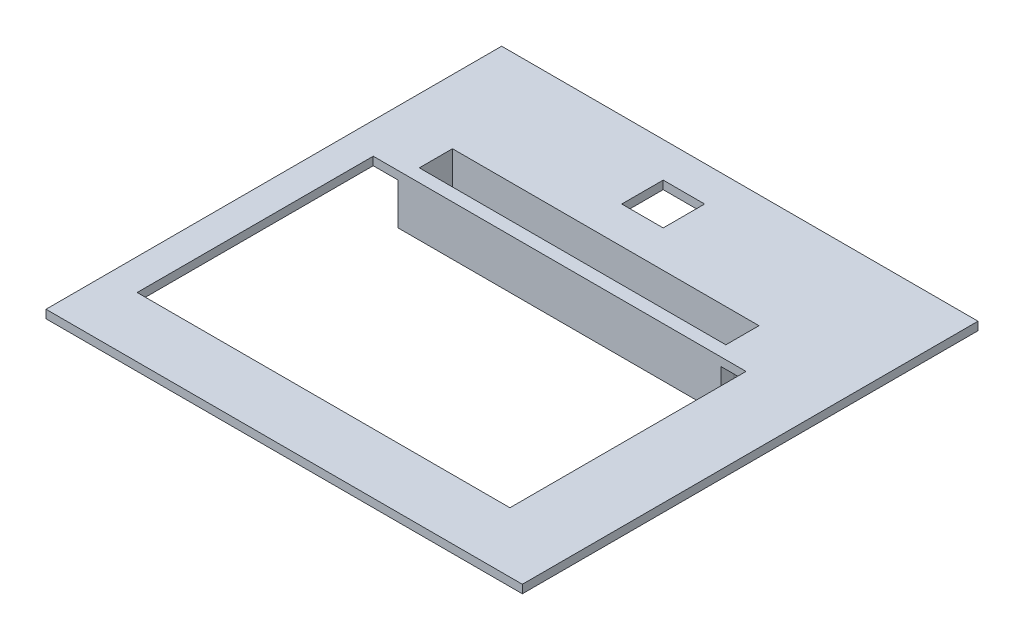
ISO-10303-21;
HEADER;
FILE_DESCRIPTION(('STEP AP214'),'2;1');
FILE_NAME('part.step','',(''),(''),'','','');
FILE_SCHEMA(('AUTOMOTIVE_DESIGN { 1 0 10303 214 1 1 1 1 }'));
ENDSEC;
DATA;
#1=APPLICATION_CONTEXT('core data for automotive mechanical design processes');
#2=APPLICATION_PROTOCOL_DEFINITION('international standard','automotive_design',2000,#1);
#3=PRODUCT_CONTEXT('',#1,'mechanical');
#4=PRODUCT('Part','Part','',(#3));
#5=PRODUCT_RELATED_PRODUCT_CATEGORY('part','',(#4));
#6=PRODUCT_DEFINITION_FORMATION('','',#4);
#7=PRODUCT_DEFINITION_CONTEXT('part definition',#1,'design');
#8=PRODUCT_DEFINITION('design','',#6,#7);
#9=PRODUCT_DEFINITION_SHAPE('','',#8);
#10=(LENGTH_UNIT() NAMED_UNIT(*) SI_UNIT(.MILLI.,.METRE.));
#11=(NAMED_UNIT(*) PLANE_ANGLE_UNIT() SI_UNIT($,.RADIAN.));
#12=(NAMED_UNIT(*) SI_UNIT($,.STERADIAN.) SOLID_ANGLE_UNIT());
#13=UNCERTAINTY_MEASURE_WITH_UNIT(LENGTH_MEASURE(1.E-05),#10,'distance_accuracy_value','');
#14=(GEOMETRIC_REPRESENTATION_CONTEXT(3) GLOBAL_UNCERTAINTY_ASSIGNED_CONTEXT((#13)) GLOBAL_UNIT_ASSIGNED_CONTEXT((#10,
#11,#12)) REPRESENTATION_CONTEXT('',''));
#15=CARTESIAN_POINT('',(0.,0.,0.));
#16=DIRECTION('',(0.,0.,1.));
#17=DIRECTION('',(1.,0.,0.));
#18=AXIS2_PLACEMENT_3D('',#15,#16,#17);
#19=CARTESIAN_POINT('',(0.,0.,0.));
#20=DIRECTION('',(0.,-1.,0.));
#21=DIRECTION('',(0.,0.,-1.));
#22=AXIS2_PLACEMENT_3D('',#19,#20,#21);
#23=PLANE('',#22);
#24=DIRECTION('',(0.,0.,1.));
#25=VECTOR('',#24,1.);
#26=CARTESIAN_POINT('',(-57.5,0.,-55.));
#27=LINE('',#26,#25);
#28=CARTESIAN_POINT('',(-57.5,0.,-55.));
#29=VERTEX_POINT('',#28);
#30=CARTESIAN_POINT('',(-57.5,0.,55.));
#31=VERTEX_POINT('',#30);
#32=EDGE_CURVE('E250',#29,#31,#27,.T.);
#33=ORIENTED_EDGE('',*,*,#32,.F.);
#34=DIRECTION('',(-1.,0.,0.));
#35=VECTOR('',#34,1.);
#36=CARTESIAN_POINT('',(57.5,0.,-55.));
#37=LINE('',#36,#35);
#38=CARTESIAN_POINT('',(57.5,0.,-55.));
#39=VERTEX_POINT('',#38);
#40=EDGE_CURVE('E243',#39,#29,#37,.T.);
#41=ORIENTED_EDGE('',*,*,#40,.F.);
#42=DIRECTION('',(0.,0.,-1.));
#43=VECTOR('',#42,1.);
#44=CARTESIAN_POINT('',(57.5,0.,-55.));
#45=LINE('',#44,#43);
#46=CARTESIAN_POINT('',(57.5,0.,55.));
#47=VERTEX_POINT('',#46);
#48=EDGE_CURVE('E246',#47,#39,#45,.T.);
#49=ORIENTED_EDGE('',*,*,#48,.F.);
#50=DIRECTION('',(1.,0.,0.));
#51=VECTOR('',#50,1.);
#52=CARTESIAN_POINT('',(57.5,0.,55.));
#53=LINE('',#52,#51);
#54=EDGE_CURVE('E248',#31,#47,#53,.T.);
#55=ORIENTED_EDGE('',*,*,#54,.F.);
#56=EDGE_LOOP('',(#33,#41,#49,#55));
#57=FACE_BOUND('',#56,.T.);
#58=DIRECTION('',(1.,0.,0.));
#59=VECTOR('',#58,1.);
#60=CARTESIAN_POINT('',(-44.,0.,-31.625));
#61=LINE('',#60,#59);
#62=CARTESIAN_POINT('',(-44.,0.,-31.625));
#63=VERTEX_POINT('',#62);
#64=CARTESIAN_POINT('',(-29.,0.,-31.625));
#65=VERTEX_POINT('',#64);
#66=EDGE_CURVE('E382',#63,#65,#61,.T.);
#67=ORIENTED_EDGE('',*,*,#66,.F.);
#68=DIRECTION('',(0.,0.,1.));
#69=VECTOR('',#68,1.);
#70=CARTESIAN_POINT('',(-44.,0.,-19.625));
#71=LINE('',#70,#69);
#72=CARTESIAN_POINT('',(-44.,0.,-16.5));
#73=VERTEX_POINT('',#72);
#74=EDGE_CURVE('E299',#63,#73,#71,.T.);
#75=ORIENTED_EDGE('',*,*,#74,.T.);
#76=DIRECTION('',(-1.,0.,0.));
#77=VECTOR('',#76,1.);
#78=CARTESIAN_POINT('',(-50.,0.,-16.5));
#79=LINE('',#78,#77);
#80=CARTESIAN_POINT('',(-50.,0.,-16.5));
#81=VERTEX_POINT('',#80);
#82=EDGE_CURVE('E285',#73,#81,#79,.T.);
#83=ORIENTED_EDGE('',*,*,#82,.T.);
#84=DIRECTION('',(0.,0.,1.));
#85=VECTOR('',#84,1.);
#86=CARTESIAN_POINT('',(-50.,0.,40.5));
#87=LINE('',#86,#85);
#88=CARTESIAN_POINT('',(-50.,0.,40.5));
#89=VERTEX_POINT('',#88);
#90=EDGE_CURVE('E292',#81,#89,#87,.T.);
#91=ORIENTED_EDGE('',*,*,#90,.T.);
#92=DIRECTION('',(1.,0.,0.));
#93=VECTOR('',#92,1.);
#94=CARTESIAN_POINT('',(-50.,0.,40.5));
#95=LINE('',#94,#93);
#96=CARTESIAN_POINT('',(40.,0.,40.5));
#97=VERTEX_POINT('',#96);
#98=EDGE_CURVE('E289',#89,#97,#95,.T.);
#99=ORIENTED_EDGE('',*,*,#98,.T.);
#100=DIRECTION('',(0.,0.,-1.));
#101=VECTOR('',#100,1.);
#102=CARTESIAN_POINT('',(40.,0.,40.5));
#103=LINE('',#102,#101);
#104=CARTESIAN_POINT('',(40.,0.,-16.5));
#105=VERTEX_POINT('',#104);
#106=EDGE_CURVE('E286',#97,#105,#103,.T.);
#107=ORIENTED_EDGE('',*,*,#106,.T.);
#108=CARTESIAN_POINT('',(34.0026845910471,0.,-16.5));
#109=VERTEX_POINT('',#108);
#110=EDGE_CURVE('E276',#105,#109,#79,.T.);
#111=ORIENTED_EDGE('',*,*,#110,.T.);
#112=DIRECTION('',(0.,0.,1.));
#113=VECTOR('',#112,1.);
#114=CARTESIAN_POINT('',(34.0026845910472,0.,-19.625));
#115=LINE('',#114,#113);
#116=CARTESIAN_POINT('',(34.0026845910472,0.,-19.625));
#117=VERTEX_POINT('',#116);
#118=EDGE_CURVE('E315',#117,#109,#115,.T.);
#119=ORIENTED_EDGE('',*,*,#118,.F.);
#120=DIRECTION('',(1.,0.,0.));
#121=VECTOR('',#120,1.);
#122=CARTESIAN_POINT('',(-44.,0.,-19.625));
#123=LINE('',#122,#121);
#124=CARTESIAN_POINT('',(34.,0.,-19.625));
#125=VERTEX_POINT('',#124);
#126=EDGE_CURVE('E215',#125,#117,#123,.T.);
#127=ORIENTED_EDGE('',*,*,#126,.F.);
#128=DIRECTION('',(0.,0.,-1.));
#129=VECTOR('',#128,1.);
#130=CARTESIAN_POINT('',(34.,0.,-19.625));
#131=LINE('',#130,#129);
#132=CARTESIAN_POINT('',(34.,0.,-31.625));
#133=VERTEX_POINT('',#132);
#134=EDGE_CURVE('E295',#125,#133,#131,.T.);
#135=ORIENTED_EDGE('',*,*,#134,.T.);
#136=DIRECTION('',(1.,0.,0.));
#137=VECTOR('',#136,1.);
#138=CARTESIAN_POINT('',(34.,0.,-31.625));
#139=LINE('',#138,#137);
#140=CARTESIAN_POINT('',(19.,0.,-31.625));
#141=VERTEX_POINT('',#140);
#142=EDGE_CURVE('E360',#141,#133,#139,.T.);
#143=ORIENTED_EDGE('',*,*,#142,.F.);
#144=DIRECTION('',(0.,0.,-1.));
#145=VECTOR('',#144,1.);
#146=CARTESIAN_POINT('',(19.,0.,-28.625));
#147=LINE('',#146,#145);
#148=CARTESIAN_POINT('',(19.,0.,-28.625));
#149=VERTEX_POINT('',#148);
#150=EDGE_CURVE('E364',#149,#141,#147,.T.);
#151=ORIENTED_EDGE('',*,*,#150,.F.);
#152=DIRECTION('',(-1.,0.,0.));
#153=VECTOR('',#152,1.);
#154=CARTESIAN_POINT('',(0.,0.,-28.625));
#155=LINE('',#154,#153);
#156=CARTESIAN_POINT('',(-29.,0.,-28.625));
#157=VERTEX_POINT('',#156);
#158=EDGE_CURVE('E328',#149,#157,#155,.T.);
#159=ORIENTED_EDGE('',*,*,#158,.T.);
#160=DIRECTION('',(0.,0.,1.));
#161=VECTOR('',#160,1.);
#162=CARTESIAN_POINT('',(-29.,0.,-28.625));
#163=LINE('',#162,#161);
#164=EDGE_CURVE('E378',#65,#157,#163,.T.);
#165=ORIENTED_EDGE('',*,*,#164,.F.);
#166=EDGE_LOOP('',(#67,#75,#83,#91,#99,#107,#111,#119,#127,#135,#143,#151,#159,#165));
#167=FACE_BOUND('',#166,.T.);
#168=DIRECTION('',(-1.,0.,0.));
#169=VECTOR('',#168,1.);
#170=CARTESIAN_POINT('',(0.,0.,-36.5));
#171=LINE('',#170,#169);
#172=CARTESIAN_POINT('',(0.,0.,-36.5));
#173=VERTEX_POINT('',#172);
#174=CARTESIAN_POINT('',(-10.,0.,-36.5));
#175=VERTEX_POINT('',#174);
#176=EDGE_CURVE('E449',#173,#175,#171,.T.);
#177=ORIENTED_EDGE('',*,*,#176,.F.);
#178=DIRECTION('',(0.,0.,-1.));
#179=VECTOR('',#178,1.);
#180=CARTESIAN_POINT('',(0.,0.,0.));
#181=LINE('',#180,#179);
#182=CARTESIAN_POINT('',(0.,0.,-46.5));
#183=VERTEX_POINT('',#182);
#184=EDGE_CURVE('E429',#173,#183,#181,.T.);
#185=ORIENTED_EDGE('',*,*,#184,.T.);
#186=DIRECTION('',(-1.,0.,0.));
#187=VECTOR('',#186,1.);
#188=CARTESIAN_POINT('',(0.,0.,-46.5));
#189=LINE('',#188,#187);
#190=CARTESIAN_POINT('',(-10.,0.,-46.5));
#191=VERTEX_POINT('',#190);
#192=EDGE_CURVE('E452',#183,#191,#189,.T.);
#193=ORIENTED_EDGE('',*,*,#192,.T.);
#194=DIRECTION('',(0.,0.,-1.));
#195=VECTOR('',#194,1.);
#196=CARTESIAN_POINT('',(-9.99999999999999,0.,0.));
#197=LINE('',#196,#195);
#198=EDGE_CURVE('E222',#175,#191,#197,.T.);
#199=ORIENTED_EDGE('',*,*,#198,.F.);
#200=EDGE_LOOP('',(#177,#185,#193,#199));
#201=FACE_BOUND('',#200,.T.);
#202=ADVANCED_FACE('F40',(#57,#167,#201),#23,.T.);
#203=CARTESIAN_POINT('',(0.,2.,0.));
#204=DIRECTION('',(0.,-1.,0.));
#205=DIRECTION('',(0.,0.,-1.));
#206=AXIS2_PLACEMENT_3D('',#203,#204,#205);
#207=PLANE('',#206);
#208=DIRECTION('',(0.,0.,1.));
#209=VECTOR('',#208,1.);
#210=CARTESIAN_POINT('',(-57.5,2.,-55.));
#211=LINE('',#210,#209);
#212=CARTESIAN_POINT('',(-57.5,2.,-55.));
#213=VERTEX_POINT('',#212);
#214=CARTESIAN_POINT('',(-57.5,2.,55.));
#215=VERTEX_POINT('',#214);
#216=EDGE_CURVE('E245',#213,#215,#211,.T.);
#217=ORIENTED_EDGE('',*,*,#216,.T.);
#218=DIRECTION('',(1.,0.,0.));
#219=VECTOR('',#218,1.);
#220=CARTESIAN_POINT('',(57.5,2.,55.));
#221=LINE('',#220,#219);
#222=CARTESIAN_POINT('',(57.5,2.,55.));
#223=VERTEX_POINT('',#222);
#224=EDGE_CURVE('E257',#215,#223,#221,.T.);
#225=ORIENTED_EDGE('',*,*,#224,.T.);
#226=DIRECTION('',(0.,0.,-1.));
#227=VECTOR('',#226,1.);
#228=CARTESIAN_POINT('',(57.5,2.,-55.));
#229=LINE('',#228,#227);
#230=CARTESIAN_POINT('',(57.5,2.,-55.));
#231=VERTEX_POINT('',#230);
#232=EDGE_CURVE('E255',#223,#231,#229,.T.);
#233=ORIENTED_EDGE('',*,*,#232,.T.);
#234=DIRECTION('',(-1.,0.,0.));
#235=VECTOR('',#234,1.);
#236=CARTESIAN_POINT('',(57.5,2.,-55.));
#237=LINE('',#236,#235);
#238=EDGE_CURVE('E242',#231,#213,#237,.T.);
#239=ORIENTED_EDGE('',*,*,#238,.T.);
#240=EDGE_LOOP('',(#217,#225,#233,#239));
#241=FACE_BOUND('',#240,.T.);
#242=DIRECTION('',(-1.,0.,0.));
#243=VECTOR('',#242,1.);
#244=CARTESIAN_POINT('',(0.,2.,40.5));
#245=LINE('',#244,#243);
#246=CARTESIAN_POINT('',(40.,2.,40.5));
#247=VERTEX_POINT('',#246);
#248=CARTESIAN_POINT('',(-50.,2.,40.5));
#249=VERTEX_POINT('',#248);
#250=EDGE_CURVE('E269',#247,#249,#245,.T.);
#251=ORIENTED_EDGE('',*,*,#250,.T.);
#252=DIRECTION('',(0.,0.,-1.));
#253=VECTOR('',#252,1.);
#254=CARTESIAN_POINT('',(-50.,2.,0.));
#255=LINE('',#254,#253);
#256=CARTESIAN_POINT('',(-50.,2.,-16.5));
#257=VERTEX_POINT('',#256);
#258=EDGE_CURVE('E253',#249,#257,#255,.T.);
#259=ORIENTED_EDGE('',*,*,#258,.T.);
#260=DIRECTION('',(1.,0.,0.));
#261=VECTOR('',#260,1.);
#262=CARTESIAN_POINT('',(0.,2.,-16.5));
#263=LINE('',#262,#261);
#264=CARTESIAN_POINT('',(40.,2.,-16.5));
#265=VERTEX_POINT('',#264);
#266=EDGE_CURVE('E263',#257,#265,#263,.T.);
#267=ORIENTED_EDGE('',*,*,#266,.T.);
#268=DIRECTION('',(0.,0.,1.));
#269=VECTOR('',#268,1.);
#270=CARTESIAN_POINT('',(40.,2.,0.));
#271=LINE('',#270,#269);
#272=EDGE_CURVE('E266',#265,#247,#271,.T.);
#273=ORIENTED_EDGE('',*,*,#272,.T.);
#274=EDGE_LOOP('',(#251,#259,#267,#273));
#275=FACE_BOUND('',#274,.T.);
#276=DIRECTION('',(-1.,0.,0.));
#277=VECTOR('',#276,1.);
#278=CARTESIAN_POINT('',(34.,2.,-27.625));
#279=LINE('',#278,#277);
#280=CARTESIAN_POINT('',(32.,2.,-27.625));
#281=VERTEX_POINT('',#280);
#282=CARTESIAN_POINT('',(-42.,2.,-27.625));
#283=VERTEX_POINT('',#282);
#284=EDGE_CURVE('E296',#281,#283,#279,.T.);
#285=ORIENTED_EDGE('',*,*,#284,.F.);
#286=DIRECTION('',(0.,0.,1.));
#287=VECTOR('',#286,1.);
#288=CARTESIAN_POINT('',(32.,2.,-27.625));
#289=LINE('',#288,#287);
#290=CARTESIAN_POINT('',(32.,2.,-19.625));
#291=VERTEX_POINT('',#290);
#292=EDGE_CURVE('E338',#281,#291,#289,.T.);
#293=ORIENTED_EDGE('',*,*,#292,.T.);
#294=DIRECTION('',(1.,0.,0.));
#295=VECTOR('',#294,1.);
#296=CARTESIAN_POINT('',(34.,2.,-19.625));
#297=LINE('',#296,#295);
#298=CARTESIAN_POINT('',(-42.,2.,-19.625));
#299=VERTEX_POINT('',#298);
#300=EDGE_CURVE('E300',#299,#291,#297,.T.);
#301=ORIENTED_EDGE('',*,*,#300,.F.);
#302=DIRECTION('',(0.,0.,-1.));
#303=VECTOR('',#302,1.);
#304=CARTESIAN_POINT('',(-42.,2.,-19.625));
#305=LINE('',#304,#303);
#306=EDGE_CURVE('E347',#299,#283,#305,.T.);
#307=ORIENTED_EDGE('',*,*,#306,.T.);
#308=EDGE_LOOP('',(#285,#293,#301,#307));
#309=FACE_BOUND('',#308,.T.);
#310=DIRECTION('',(0.,0.,-1.));
#311=VECTOR('',#310,1.);
#312=CARTESIAN_POINT('',(0.,2.,0.));
#313=LINE('',#312,#311);
#314=CARTESIAN_POINT('',(0.,2.,-36.5));
#315=VERTEX_POINT('',#314);
#316=CARTESIAN_POINT('',(0.,2.,-46.5));
#317=VERTEX_POINT('',#316);
#318=EDGE_CURVE('E11',#315,#317,#313,.T.);
#319=ORIENTED_EDGE('',*,*,#318,.F.);
#320=DIRECTION('',(-1.,0.,0.));
#321=VECTOR('',#320,1.);
#322=CARTESIAN_POINT('',(0.,2.,-36.5));
#323=LINE('',#322,#321);
#324=CARTESIAN_POINT('',(-10.,2.,-36.5));
#325=VERTEX_POINT('',#324);
#326=EDGE_CURVE('E48',#315,#325,#323,.T.);
#327=ORIENTED_EDGE('',*,*,#326,.T.);
#328=DIRECTION('',(0.,0.,-1.));
#329=VECTOR('',#328,1.);
#330=CARTESIAN_POINT('',(-9.99999999999999,2.,0.));
#331=LINE('',#330,#329);
#332=CARTESIAN_POINT('',(-10.,2.,-46.5));
#333=VERTEX_POINT('',#332);
#334=EDGE_CURVE('E214',#325,#333,#331,.T.);
#335=ORIENTED_EDGE('',*,*,#334,.T.);
#336=DIRECTION('',(-1.,0.,0.));
#337=VECTOR('',#336,1.);
#338=CARTESIAN_POINT('',(0.,2.,-46.5));
#339=LINE('',#338,#337);
#340=EDGE_CURVE('E209',#317,#333,#339,.T.);
#341=ORIENTED_EDGE('',*,*,#340,.F.);
#342=EDGE_LOOP('',(#319,#327,#335,#341));
#343=FACE_BOUND('',#342,.T.);
#344=ADVANCED_FACE('F227',(#241,#275,#309,#343),#207,.F.);
#345=CARTESIAN_POINT('',(0.,-8.,0.));
#346=DIRECTION('',(0.,-1.,0.));
#347=DIRECTION('',(0.,0.,-1.));
#348=AXIS2_PLACEMENT_3D('',#345,#346,#347);
#349=PLANE('',#348);
#350=CARTESIAN_POINT('',(25.,-8.,-23.625));
#351=DIRECTION('',(0.,1.,0.));
#352=DIRECTION('',(0.,0.,1.));
#353=AXIS2_PLACEMENT_3D('',#350,#351,#352);
#354=CIRCLE('',#353,2.375);
#355=CARTESIAN_POINT('',(25.,-8.,-21.25));
#356=VERTEX_POINT('',#355);
#357=EDGE_CURVE('E424',#356,#356,#354,.T.);
#358=ORIENTED_EDGE('',*,*,#357,.F.);
#359=EDGE_LOOP('',(#358));
#360=FACE_BOUND('',#359,.T.);
#361=CARTESIAN_POINT('',(-9.29000000000002,-8.,-23.625));
#362=DIRECTION('',(0.,1.,0.));
#363=DIRECTION('',(0.,0.,1.));
#364=AXIS2_PLACEMENT_3D('',#361,#362,#363);
#365=CIRCLE('',#364,2.375);
#366=CARTESIAN_POINT('',(-9.29000000000002,-8.,-21.25));
#367=VERTEX_POINT('',#366);
#368=EDGE_CURVE('E425',#367,#367,#365,.T.);
#369=ORIENTED_EDGE('',*,*,#368,.F.);
#370=EDGE_LOOP('',(#369));
#371=FACE_BOUND('',#370,.T.);
#372=CARTESIAN_POINT('',(16.42,-8.,-23.625));
#373=DIRECTION('',(0.,1.,0.));
#374=DIRECTION('',(0.,0.,1.));
#375=AXIS2_PLACEMENT_3D('',#372,#373,#374);
#376=CIRCLE('',#375,2.375);
#377=CARTESIAN_POINT('',(16.42,-8.,-21.25));
#378=VERTEX_POINT('',#377);
#379=EDGE_CURVE('E432',#378,#378,#376,.T.);
#380=ORIENTED_EDGE('',*,*,#379,.F.);
#381=EDGE_LOOP('',(#380));
#382=FACE_BOUND('',#381,.T.);
#383=CARTESIAN_POINT('',(7.84999999999998,-8.,-23.625));
#384=DIRECTION('',(0.,1.,0.));
#385=DIRECTION('',(0.,0.,1.));
#386=AXIS2_PLACEMENT_3D('',#383,#384,#385);
#387=CIRCLE('',#386,2.375);
#388=CARTESIAN_POINT('',(7.84999999999998,-8.,-21.25));
#389=VERTEX_POINT('',#388);
#390=EDGE_CURVE('E438',#389,#389,#387,.T.);
#391=ORIENTED_EDGE('',*,*,#390,.F.);
#392=EDGE_LOOP('',(#391));
#393=FACE_BOUND('',#392,.T.);
#394=CARTESIAN_POINT('',(-17.86,-8.,-23.625));
#395=DIRECTION('',(0.,1.,0.));
#396=DIRECTION('',(0.,0.,1.));
#397=AXIS2_PLACEMENT_3D('',#394,#395,#396);
#398=CIRCLE('',#397,2.375);
#399=CARTESIAN_POINT('',(-17.86,-8.,-21.25));
#400=VERTEX_POINT('',#399);
#401=EDGE_CURVE('E406',#400,#400,#398,.T.);
#402=ORIENTED_EDGE('',*,*,#401,.F.);
#403=EDGE_LOOP('',(#402));
#404=FACE_BOUND('',#403,.T.);
#405=CARTESIAN_POINT('',(-26.43,-8.,-23.625));
#406=DIRECTION('',(0.,1.,0.));
#407=DIRECTION('',(0.,0.,1.));
#408=AXIS2_PLACEMENT_3D('',#405,#406,#407);
#409=CIRCLE('',#408,2.375);
#410=CARTESIAN_POINT('',(-26.43,-8.,-21.25));
#411=VERTEX_POINT('',#410);
#412=EDGE_CURVE('E412',#411,#411,#409,.T.);
#413=ORIENTED_EDGE('',*,*,#412,.F.);
#414=EDGE_LOOP('',(#413));
#415=FACE_BOUND('',#414,.T.);
#416=CARTESIAN_POINT('',(-35.,-8.,-23.625));
#417=DIRECTION('',(0.,1.,0.));
#418=DIRECTION('',(0.,0.,1.));
#419=AXIS2_PLACEMENT_3D('',#416,#417,#418);
#420=CIRCLE('',#419,2.375);
#421=CARTESIAN_POINT('',(-35.,-8.,-21.25));
#422=VERTEX_POINT('',#421);
#423=EDGE_CURVE('E418',#422,#422,#420,.T.);
#424=ORIENTED_EDGE('',*,*,#423,.F.);
#425=EDGE_LOOP('',(#424));
#426=FACE_BOUND('',#425,.T.);
#427=DIRECTION('',(-1.,0.,0.));
#428=VECTOR('',#427,1.);
#429=CARTESIAN_POINT('',(32.,-8.,-27.625));
#430=LINE('',#429,#428);
#431=CARTESIAN_POINT('',(32.,-8.,-27.625));
#432=VERTEX_POINT('',#431);
#433=CARTESIAN_POINT('',(-42.,-8.,-27.625));
#434=VERTEX_POINT('',#433);
#435=EDGE_CURVE('E396',#432,#434,#430,.T.);
#436=ORIENTED_EDGE('',*,*,#435,.T.);
#437=DIRECTION('',(0.,0.,-1.));
#438=VECTOR('',#437,1.);
#439=CARTESIAN_POINT('',(-42.,-8.,-19.625));
#440=LINE('',#439,#438);
#441=CARTESIAN_POINT('',(-42.,-8.,-19.625));
#442=VERTEX_POINT('',#441);
#443=EDGE_CURVE('E393',#442,#434,#440,.T.);
#444=ORIENTED_EDGE('',*,*,#443,.F.);
#445=DIRECTION('',(-1.,0.,0.));
#446=VECTOR('',#445,1.);
#447=CARTESIAN_POINT('',(32.,-8.,-19.625));
#448=LINE('',#447,#446);
#449=CARTESIAN_POINT('',(32.,-8.,-19.625));
#450=VERTEX_POINT('',#449);
#451=EDGE_CURVE('E390',#450,#442,#448,.T.);
#452=ORIENTED_EDGE('',*,*,#451,.F.);
#453=DIRECTION('',(0.,0.,-1.));
#454=VECTOR('',#453,1.);
#455=CARTESIAN_POINT('',(32.,-8.,-19.625));
#456=LINE('',#455,#454);
#457=EDGE_CURVE('E385',#450,#432,#456,.T.);
#458=ORIENTED_EDGE('',*,*,#457,.T.);
#459=EDGE_LOOP('',(#436,#444,#452,#458));
#460=FACE_BOUND('',#459,.T.);
#461=CARTESIAN_POINT('',(-0.720000000000023,-8.,-23.625));
#462=DIRECTION('',(0.,1.,0.));
#463=DIRECTION('',(0.,0.,1.));
#464=AXIS2_PLACEMENT_3D('',#461,#462,#463);
#465=CIRCLE('',#464,2.375);
#466=CARTESIAN_POINT('',(-0.720000000000023,-8.,-21.25));
#467=VERTEX_POINT('',#466);
#468=EDGE_CURVE('E399',#467,#467,#465,.T.);
#469=ORIENTED_EDGE('',*,*,#468,.F.);
#470=EDGE_LOOP('',(#469));
#471=FACE_BOUND('',#470,.T.);
#472=ADVANCED_FACE('F472',(#360,#371,#382,#393,#404,#415,#426,#460,#471),#349,.F.);
#473=CARTESIAN_POINT('',(34.,0.,-27.625));
#474=DIRECTION('',(0.,0.,-1.));
#475=DIRECTION('',(-1.,0.,0.));
#476=AXIS2_PLACEMENT_3D('',#473,#474,#475);
#477=PLANE('',#476);
#478=ORIENTED_EDGE('',*,*,#435,.F.);
#479=DIRECTION('',(0.,1.,0.));
#480=VECTOR('',#479,1.);
#481=CARTESIAN_POINT('',(32.,-10.,-27.625));
#482=LINE('',#481,#480);
#483=EDGE_CURVE('E335',#432,#281,#482,.T.);
#484=ORIENTED_EDGE('',*,*,#483,.T.);
#485=ORIENTED_EDGE('',*,*,#284,.T.);
#486=DIRECTION('',(0.,1.,0.));
#487=VECTOR('',#486,1.);
#488=CARTESIAN_POINT('',(-42.,-10.,-27.625));
#489=LINE('',#488,#487);
#490=EDGE_CURVE('E344',#434,#283,#489,.T.);
#491=ORIENTED_EDGE('',*,*,#490,.F.);
#492=EDGE_LOOP('',(#478,#484,#485,#491));
#493=FACE_BOUND('',#492,.T.);
#494=ADVANCED_FACE('F513',(#493),#477,.F.);
#495=CARTESIAN_POINT('',(34.,0.,-19.625));
#496=DIRECTION('',(0.,0.,1.));
#497=DIRECTION('',(1.,0.,0.));
#498=AXIS2_PLACEMENT_3D('',#495,#496,#497);
#499=PLANE('',#498);
#500=ORIENTED_EDGE('',*,*,#451,.T.);
#501=DIRECTION('',(0.,1.,0.));
#502=VECTOR('',#501,1.);
#503=CARTESIAN_POINT('',(-42.,-10.,-19.625));
#504=LINE('',#503,#502);
#505=EDGE_CURVE('E345',#442,#299,#504,.T.);
#506=ORIENTED_EDGE('',*,*,#505,.T.);
#507=ORIENTED_EDGE('',*,*,#300,.T.);
#508=DIRECTION('',(0.,1.,0.));
#509=VECTOR('',#508,1.);
#510=CARTESIAN_POINT('',(32.,-10.,-19.625));
#511=LINE('',#510,#509);
#512=EDGE_CURVE('E337',#450,#291,#511,.T.);
#513=ORIENTED_EDGE('',*,*,#512,.F.);
#514=EDGE_LOOP('',(#500,#506,#507,#513));
#515=FACE_BOUND('',#514,.T.);
#516=ADVANCED_FACE('F520',(#515),#499,.F.);
#517=CARTESIAN_POINT('',(32.,-10.,-27.625));
#518=DIRECTION('',(-1.,0.,0.));
#519=DIRECTION('',(0.,0.,1.));
#520=AXIS2_PLACEMENT_3D('',#517,#518,#519);
#521=PLANE('',#520);
#522=ORIENTED_EDGE('',*,*,#483,.F.);
#523=ORIENTED_EDGE('',*,*,#457,.F.);
#524=ORIENTED_EDGE('',*,*,#512,.T.);
#525=ORIENTED_EDGE('',*,*,#292,.F.);
#526=EDGE_LOOP('',(#522,#523,#524,#525));
#527=FACE_BOUND('',#526,.T.);
#528=ADVANCED_FACE('F517',(#527),#521,.T.);
#529=CARTESIAN_POINT('',(-42.,-10.,-19.625));
#530=DIRECTION('',(1.,0.,0.));
#531=DIRECTION('',(0.,0.,-1.));
#532=AXIS2_PLACEMENT_3D('',#529,#530,#531);
#533=PLANE('',#532);
#534=ORIENTED_EDGE('',*,*,#505,.F.);
#535=ORIENTED_EDGE('',*,*,#443,.T.);
#536=ORIENTED_EDGE('',*,*,#490,.T.);
#537=ORIENTED_EDGE('',*,*,#306,.F.);
#538=EDGE_LOOP('',(#534,#535,#536,#537));
#539=FACE_BOUND('',#538,.T.);
#540=ADVANCED_FACE('F523',(#539),#533,.T.);
#541=CARTESIAN_POINT('',(0.,-10.,-28.625));
#542=DIRECTION('',(0.,0.,-1.));
#543=DIRECTION('',(-1.,0.,0.));
#544=AXIS2_PLACEMENT_3D('',#541,#542,#543);
#545=PLANE('',#544);
#546=DIRECTION('',(-1.,0.,0.));
#547=VECTOR('',#546,1.);
#548=CARTESIAN_POINT('',(0.,-10.,-28.625));
#549=LINE('',#548,#547);
#550=CARTESIAN_POINT('',(19.,-10.,-28.625));
#551=VERTEX_POINT('',#550);
#552=CARTESIAN_POINT('',(-29.,-10.,-28.625));
#553=VERTEX_POINT('',#552);
#554=EDGE_CURVE('E331',#551,#553,#549,.T.);
#555=ORIENTED_EDGE('',*,*,#554,.T.);
#556=DIRECTION('',(0.,1.,0.));
#557=VECTOR('',#556,1.);
#558=CARTESIAN_POINT('',(-29.,-10.,-28.625));
#559=LINE('',#558,#557);
#560=EDGE_CURVE('E375',#553,#157,#559,.T.);
#561=ORIENTED_EDGE('',*,*,#560,.T.);
#562=ORIENTED_EDGE('',*,*,#158,.F.);
#563=DIRECTION('',(0.,1.,0.));
#564=VECTOR('',#563,1.);
#565=CARTESIAN_POINT('',(19.,-10.,-28.625));
#566=LINE('',#565,#564);
#567=EDGE_CURVE('E351',#551,#149,#566,.T.);
#568=ORIENTED_EDGE('',*,*,#567,.F.);
#569=EDGE_LOOP('',(#555,#561,#562,#568));
#570=FACE_BOUND('',#569,.T.);
#571=ADVANCED_FACE('F568',(#570),#545,.T.);
#572=DIRECTION('',(1.,0.,0.));
#573=VECTOR('',#572,1.);
#574=CARTESIAN_POINT('',(-44.,-10.,-19.625));
#575=LINE('',#574,#573);
#576=CARTESIAN_POINT('',(34.,-10.,-19.625));
#577=VERTEX_POINT('',#576);
#578=CARTESIAN_POINT('',(34.0026845910472,-10.,-19.625));
#579=VERTEX_POINT('',#578);
#580=EDGE_CURVE('E325',#577,#579,#575,.T.);
#581=ORIENTED_EDGE('',*,*,#580,.F.);
#582=DIRECTION('',(0.,1.,0.));
#583=VECTOR('',#582,1.);
#584=CARTESIAN_POINT('',(34.,-10.,-19.625));
#585=LINE('',#584,#583);
#586=EDGE_CURVE('E332',#577,#125,#585,.T.);
#587=ORIENTED_EDGE('',*,*,#586,.T.);
#588=ORIENTED_EDGE('',*,*,#126,.T.);
#589=DIRECTION('',(0.,1.,0.));
#590=VECTOR('',#589,1.);
#591=CARTESIAN_POINT('',(34.0026845910472,-10.,-19.625));
#592=LINE('',#591,#590);
#593=EDGE_CURVE('E303',#579,#117,#592,.T.);
#594=ORIENTED_EDGE('',*,*,#593,.F.);
#595=EDGE_LOOP('',(#581,#587,#588,#594));
#596=FACE_BOUND('',#595,.T.);
#597=ADVANCED_FACE('F493',(#596),#499,.F.);
#598=CARTESIAN_POINT('',(-57.5,2.,-55.));
#599=DIRECTION('',(1.,0.,0.));
#600=DIRECTION('',(0.,0.,-1.));
#601=AXIS2_PLACEMENT_3D('',#598,#599,#600);
#602=PLANE('',#601);
#603=ORIENTED_EDGE('',*,*,#32,.T.);
#604=DIRECTION('',(0.,-1.,0.));
#605=VECTOR('',#604,1.);
#606=CARTESIAN_POINT('',(-57.5,2.,55.));
#607=LINE('',#606,#605);
#608=EDGE_CURVE('E230',#215,#31,#607,.T.);
#609=ORIENTED_EDGE('',*,*,#608,.F.);
#610=ORIENTED_EDGE('',*,*,#216,.F.);
#611=DIRECTION('',(0.,-1.,0.));
#612=VECTOR('',#611,1.);
#613=CARTESIAN_POINT('',(-57.5,2.,-55.));
#614=LINE('',#613,#612);
#615=EDGE_CURVE('E239',#213,#29,#614,.T.);
#616=ORIENTED_EDGE('',*,*,#615,.T.);
#617=EDGE_LOOP('',(#603,#609,#610,#616));
#618=FACE_BOUND('',#617,.T.);
#619=ADVANCED_FACE('F42',(#618),#602,.F.);
#620=CARTESIAN_POINT('',(57.5,2.,55.));
#621=DIRECTION('',(0.,0.,-1.));
#622=DIRECTION('',(-1.,0.,0.));
#623=AXIS2_PLACEMENT_3D('',#620,#621,#622);
#624=PLANE('',#623);
#625=ORIENTED_EDGE('',*,*,#54,.T.);
#626=DIRECTION('',(0.,-1.,0.));
#627=VECTOR('',#626,1.);
#628=CARTESIAN_POINT('',(57.5,2.,55.));
#629=LINE('',#628,#627);
#630=EDGE_CURVE('E233',#223,#47,#629,.T.);
#631=ORIENTED_EDGE('',*,*,#630,.F.);
#632=ORIENTED_EDGE('',*,*,#224,.F.);
#633=ORIENTED_EDGE('',*,*,#608,.T.);
#634=EDGE_LOOP('',(#625,#631,#632,#633));
#635=FACE_BOUND('',#634,.T.);
#636=ADVANCED_FACE('F486',(#635),#624,.F.);
#637=CARTESIAN_POINT('',(57.5,2.,-55.));
#638=DIRECTION('',(-1.,0.,0.));
#639=DIRECTION('',(0.,0.,1.));
#640=AXIS2_PLACEMENT_3D('',#637,#638,#639);
#641=PLANE('',#640);
#642=ORIENTED_EDGE('',*,*,#48,.T.);
#643=DIRECTION('',(0.,-1.,0.));
#644=VECTOR('',#643,1.);
#645=CARTESIAN_POINT('',(57.5,2.,-55.));
#646=LINE('',#645,#644);
#647=EDGE_CURVE('E236',#231,#39,#646,.T.);
#648=ORIENTED_EDGE('',*,*,#647,.F.);
#649=ORIENTED_EDGE('',*,*,#232,.F.);
#650=ORIENTED_EDGE('',*,*,#630,.T.);
#651=EDGE_LOOP('',(#642,#648,#649,#650));
#652=FACE_BOUND('',#651,.T.);
#653=ADVANCED_FACE('F483',(#652),#641,.F.);
#654=CARTESIAN_POINT('',(57.5,2.,-55.));
#655=DIRECTION('',(0.,0.,1.));
#656=DIRECTION('',(1.,0.,0.));
#657=AXIS2_PLACEMENT_3D('',#654,#655,#656);
#658=PLANE('',#657);
#659=ORIENTED_EDGE('',*,*,#40,.T.);
#660=ORIENTED_EDGE('',*,*,#615,.F.);
#661=ORIENTED_EDGE('',*,*,#238,.F.);
#662=ORIENTED_EDGE('',*,*,#647,.T.);
#663=EDGE_LOOP('',(#659,#660,#661,#662));
#664=FACE_BOUND('',#663,.T.);
#665=ADVANCED_FACE('F479',(#664),#658,.F.);
#666=CARTESIAN_POINT('',(-50.,0.,40.5));
#667=DIRECTION('',(-1.,0.,0.));
#668=DIRECTION('',(0.,0.,1.));
#669=AXIS2_PLACEMENT_3D('',#666,#667,#668);
#670=PLANE('',#669);
#671=DIRECTION('',(0.,1.,0.));
#672=VECTOR('',#671,1.);
#673=CARTESIAN_POINT('',(-50.,0.,40.5));
#674=LINE('',#673,#672);
#675=EDGE_CURVE('E273',#89,#249,#674,.T.);
#676=ORIENTED_EDGE('',*,*,#675,.F.);
#677=ORIENTED_EDGE('',*,*,#90,.F.);
#678=DIRECTION('',(0.,1.,0.));
#679=VECTOR('',#678,1.);
#680=CARTESIAN_POINT('',(-50.,0.,-16.5));
#681=LINE('',#680,#679);
#682=EDGE_CURVE('E272',#81,#257,#681,.T.);
#683=ORIENTED_EDGE('',*,*,#682,.T.);
#684=ORIENTED_EDGE('',*,*,#258,.F.);
#685=EDGE_LOOP('',(#676,#677,#683,#684));
#686=FACE_BOUND('',#685,.T.);
#687=ADVANCED_FACE('F482',(#686),#670,.F.);
#688=CARTESIAN_POINT('',(-50.,0.,-16.5));
#689=DIRECTION('',(0.,0.,-1.));
#690=DIRECTION('',(-1.,0.,0.));
#691=AXIS2_PLACEMENT_3D('',#688,#689,#690);
#692=PLANE('',#691);
#693=ORIENTED_EDGE('',*,*,#682,.F.);
#694=ORIENTED_EDGE('',*,*,#82,.F.);
#695=DIRECTION('',(0.,1.,0.));
#696=VECTOR('',#695,1.);
#697=CARTESIAN_POINT('',(-44.,-10.,-16.5));
#698=LINE('',#697,#696);
#699=CARTESIAN_POINT('',(-44.,-10.,-16.5));
#700=VERTEX_POINT('',#699);
#701=EDGE_CURVE('E311',#700,#73,#698,.T.);
#702=ORIENTED_EDGE('',*,*,#701,.F.);
#703=DIRECTION('',(-1.,0.,0.));
#704=VECTOR('',#703,1.);
#705=CARTESIAN_POINT('',(-44.,-10.,-16.5));
#706=LINE('',#705,#704);
#707=CARTESIAN_POINT('',(34.0026845910472,-10.,-16.5));
#708=VERTEX_POINT('',#707);
#709=EDGE_CURVE('E314',#708,#700,#706,.T.);
#710=ORIENTED_EDGE('',*,*,#709,.F.);
#711=DIRECTION('',(0.,1.,0.));
#712=VECTOR('',#711,1.);
#713=CARTESIAN_POINT('',(34.0026845910472,-10.,-16.5));
#714=LINE('',#713,#712);
#715=EDGE_CURVE('E308',#708,#109,#714,.T.);
#716=ORIENTED_EDGE('',*,*,#715,.T.);
#717=ORIENTED_EDGE('',*,*,#110,.F.);
#718=DIRECTION('',(0.,1.,0.));
#719=VECTOR('',#718,1.);
#720=CARTESIAN_POINT('',(40.,0.,-16.5));
#721=LINE('',#720,#719);
#722=EDGE_CURVE('E279',#105,#265,#721,.T.);
#723=ORIENTED_EDGE('',*,*,#722,.T.);
#724=ORIENTED_EDGE('',*,*,#266,.F.);
#725=EDGE_LOOP('',(#693,#694,#702,#710,#716,#717,#723,#724));
#726=FACE_BOUND('',#725,.T.);
#727=ADVANCED_FACE('F594',(#726),#692,.F.);
#728=CARTESIAN_POINT('',(40.,0.,40.5));
#729=DIRECTION('',(1.,0.,0.));
#730=DIRECTION('',(0.,0.,-1.));
#731=AXIS2_PLACEMENT_3D('',#728,#729,#730);
#732=PLANE('',#731);
#733=ORIENTED_EDGE('',*,*,#722,.F.);
#734=ORIENTED_EDGE('',*,*,#106,.F.);
#735=DIRECTION('',(0.,1.,0.));
#736=VECTOR('',#735,1.);
#737=CARTESIAN_POINT('',(40.,0.,40.5));
#738=LINE('',#737,#736);
#739=EDGE_CURVE('E275',#97,#247,#738,.T.);
#740=ORIENTED_EDGE('',*,*,#739,.T.);
#741=ORIENTED_EDGE('',*,*,#272,.F.);
#742=EDGE_LOOP('',(#733,#734,#740,#741));
#743=FACE_BOUND('',#742,.T.);
#744=ADVANCED_FACE('F597',(#743),#732,.F.);
#745=CARTESIAN_POINT('',(-50.,0.,40.5));
#746=DIRECTION('',(0.,0.,1.));
#747=DIRECTION('',(1.,0.,0.));
#748=AXIS2_PLACEMENT_3D('',#745,#746,#747);
#749=PLANE('',#748);
#750=ORIENTED_EDGE('',*,*,#739,.F.);
#751=ORIENTED_EDGE('',*,*,#98,.F.);
#752=ORIENTED_EDGE('',*,*,#675,.T.);
#753=ORIENTED_EDGE('',*,*,#250,.F.);
#754=EDGE_LOOP('',(#750,#751,#752,#753));
#755=FACE_BOUND('',#754,.T.);
#756=ADVANCED_FACE('F588',(#755),#749,.F.);
#757=CARTESIAN_POINT('',(-44.,-10.,-19.625));
#758=DIRECTION('',(1.,0.,0.));
#759=DIRECTION('',(0.,0.,-1.));
#760=AXIS2_PLACEMENT_3D('',#757,#758,#759);
#761=PLANE('',#760);
#762=ORIENTED_EDGE('',*,*,#701,.T.);
#763=ORIENTED_EDGE('',*,*,#74,.F.);
#764=DIRECTION('',(0.,1.,0.));
#765=VECTOR('',#764,1.);
#766=CARTESIAN_POINT('',(-44.,-10.,-31.625));
#767=LINE('',#766,#765);
#768=CARTESIAN_POINT('',(-44.,-10.,-31.625));
#769=VERTEX_POINT('',#768);
#770=EDGE_CURVE('E366',#769,#63,#767,.T.);
#771=ORIENTED_EDGE('',*,*,#770,.F.);
#772=DIRECTION('',(0.,0.,-1.));
#773=VECTOR('',#772,1.);
#774=CARTESIAN_POINT('',(-44.,-10.,-19.625));
#775=LINE('',#774,#773);
#776=EDGE_CURVE('E318',#700,#769,#775,.T.);
#777=ORIENTED_EDGE('',*,*,#776,.F.);
#778=EDGE_LOOP('',(#762,#763,#771,#777));
#779=FACE_BOUND('',#778,.T.);
#780=ADVANCED_FACE('F584',(#779),#761,.F.);
#781=CARTESIAN_POINT('',(34.0026845910472,-10.,-19.625));
#782=DIRECTION('',(-1.,0.,0.));
#783=DIRECTION('',(0.,0.,1.));
#784=AXIS2_PLACEMENT_3D('',#781,#782,#783);
#785=PLANE('',#784);
#786=ORIENTED_EDGE('',*,*,#118,.T.);
#787=ORIENTED_EDGE('',*,*,#715,.F.);
#788=DIRECTION('',(0.,0.,1.));
#789=VECTOR('',#788,1.);
#790=CARTESIAN_POINT('',(34.0026845910472,-10.,-19.625));
#791=LINE('',#790,#789);
#792=EDGE_CURVE('E323',#579,#708,#791,.T.);
#793=ORIENTED_EDGE('',*,*,#792,.F.);
#794=ORIENTED_EDGE('',*,*,#593,.T.);
#795=EDGE_LOOP('',(#786,#787,#793,#794));
#796=FACE_BOUND('',#795,.T.);
#797=ADVANCED_FACE('F580',(#796),#785,.F.);
#798=CARTESIAN_POINT('',(0.,-10.,0.));
#799=DIRECTION('',(0.,1.,0.));
#800=DIRECTION('',(0.,0.,1.));
#801=AXIS2_PLACEMENT_3D('',#798,#799,#800);
#802=PLANE('',#801);
#803=CARTESIAN_POINT('',(25.,-10.,-23.625));
#804=DIRECTION('',(0.,1.,0.));
#805=DIRECTION('',(0.,0.,1.));
#806=AXIS2_PLACEMENT_3D('',#803,#804,#805);
#807=CIRCLE('',#806,2.375);
#808=CARTESIAN_POINT('',(25.,-10.,-21.25));
#809=VERTEX_POINT('',#808);
#810=EDGE_CURVE('E398',#809,#809,#807,.T.);
#811=ORIENTED_EDGE('',*,*,#810,.T.);
#812=EDGE_LOOP('',(#811));
#813=FACE_BOUND('',#812,.T.);
#814=CARTESIAN_POINT('',(-9.29000000000002,-10.,-23.625));
#815=DIRECTION('',(0.,1.,0.));
#816=DIRECTION('',(0.,0.,1.));
#817=AXIS2_PLACEMENT_3D('',#814,#815,#816);
#818=CIRCLE('',#817,2.375);
#819=CARTESIAN_POINT('',(-9.29000000000002,-10.,-21.25));
#820=VERTEX_POINT('',#819);
#821=EDGE_CURVE('E428',#820,#820,#818,.T.);
#822=ORIENTED_EDGE('',*,*,#821,.T.);
#823=EDGE_LOOP('',(#822));
#824=FACE_BOUND('',#823,.T.);
#825=CARTESIAN_POINT('',(16.42,-10.,-23.625));
#826=DIRECTION('',(0.,1.,0.));
#827=DIRECTION('',(0.,0.,1.));
#828=AXIS2_PLACEMENT_3D('',#825,#826,#827);
#829=CIRCLE('',#828,2.375);
#830=CARTESIAN_POINT('',(16.42,-10.,-21.25));
#831=VERTEX_POINT('',#830);
#832=EDGE_CURVE('E435',#831,#831,#829,.T.);
#833=ORIENTED_EDGE('',*,*,#832,.T.);
#834=EDGE_LOOP('',(#833));
#835=FACE_BOUND('',#834,.T.);
#836=CARTESIAN_POINT('',(7.84999999999998,-10.,-23.625));
#837=DIRECTION('',(0.,1.,0.));
#838=DIRECTION('',(0.,0.,1.));
#839=AXIS2_PLACEMENT_3D('',#836,#837,#838);
#840=CIRCLE('',#839,2.375);
#841=CARTESIAN_POINT('',(7.84999999999998,-10.,-21.25));
#842=VERTEX_POINT('',#841);
#843=EDGE_CURVE('E403',#842,#842,#840,.T.);
#844=ORIENTED_EDGE('',*,*,#843,.T.);
#845=EDGE_LOOP('',(#844));
#846=FACE_BOUND('',#845,.T.);
#847=CARTESIAN_POINT('',(-0.720000000000023,-10.,-23.625));
#848=DIRECTION('',(0.,1.,0.));
#849=DIRECTION('',(0.,0.,1.));
#850=AXIS2_PLACEMENT_3D('',#847,#848,#849);
#851=CIRCLE('',#850,2.375);
#852=CARTESIAN_POINT('',(-0.720000000000023,-10.,-21.25));
#853=VERTEX_POINT('',#852);
#854=EDGE_CURVE('E402',#853,#853,#851,.T.);
#855=ORIENTED_EDGE('',*,*,#854,.T.);
#856=EDGE_LOOP('',(#855));
#857=FACE_BOUND('',#856,.T.);
#858=CARTESIAN_POINT('',(-17.86,-10.,-23.625));
#859=DIRECTION('',(0.,1.,0.));
#860=DIRECTION('',(0.,0.,1.));
#861=AXIS2_PLACEMENT_3D('',#858,#859,#860);
#862=CIRCLE('',#861,2.375);
#863=CARTESIAN_POINT('',(-17.86,-10.,-21.25));
#864=VERTEX_POINT('',#863);
#865=EDGE_CURVE('E409',#864,#864,#862,.T.);
#866=ORIENTED_EDGE('',*,*,#865,.T.);
#867=EDGE_LOOP('',(#866));
#868=FACE_BOUND('',#867,.T.);
#869=CARTESIAN_POINT('',(-26.43,-10.,-23.625));
#870=DIRECTION('',(0.,1.,0.));
#871=DIRECTION('',(0.,0.,1.));
#872=AXIS2_PLACEMENT_3D('',#869,#870,#871);
#873=CIRCLE('',#872,2.375);
#874=CARTESIAN_POINT('',(-26.43,-10.,-21.25));
#875=VERTEX_POINT('',#874);
#876=EDGE_CURVE('E415',#875,#875,#873,.T.);
#877=ORIENTED_EDGE('',*,*,#876,.T.);
#878=EDGE_LOOP('',(#877));
#879=FACE_BOUND('',#878,.T.);
#880=CARTESIAN_POINT('',(-35.,-10.,-23.625));
#881=DIRECTION('',(0.,1.,0.));
#882=DIRECTION('',(0.,0.,1.));
#883=AXIS2_PLACEMENT_3D('',#880,#881,#882);
#884=CIRCLE('',#883,2.375);
#885=CARTESIAN_POINT('',(-35.,-10.,-21.25));
#886=VERTEX_POINT('',#885);
#887=EDGE_CURVE('E421',#886,#886,#884,.T.);
#888=ORIENTED_EDGE('',*,*,#887,.T.);
#889=EDGE_LOOP('',(#888));
#890=FACE_BOUND('',#889,.T.);
#891=ORIENTED_EDGE('',*,*,#776,.T.);
#892=DIRECTION('',(1.,0.,0.));
#893=VECTOR('',#892,1.);
#894=CARTESIAN_POINT('',(-44.,-10.,-31.625));
#895=LINE('',#894,#893);
#896=CARTESIAN_POINT('',(-29.,-10.,-31.625));
#897=VERTEX_POINT('',#896);
#898=EDGE_CURVE('E381',#769,#897,#895,.T.);
#899=ORIENTED_EDGE('',*,*,#898,.T.);
#900=DIRECTION('',(0.,0.,1.));
#901=VECTOR('',#900,1.);
#902=CARTESIAN_POINT('',(-29.,-10.,-28.625));
#903=LINE('',#902,#901);
#904=EDGE_CURVE('E377',#897,#553,#903,.T.);
#905=ORIENTED_EDGE('',*,*,#904,.T.);
#906=ORIENTED_EDGE('',*,*,#554,.F.);
#907=DIRECTION('',(0.,0.,-1.));
#908=VECTOR('',#907,1.);
#909=CARTESIAN_POINT('',(19.,-10.,-28.625));
#910=LINE('',#909,#908);
#911=CARTESIAN_POINT('',(19.,-10.,-31.625));
#912=VERTEX_POINT('',#911);
#913=EDGE_CURVE('E363',#551,#912,#910,.T.);
#914=ORIENTED_EDGE('',*,*,#913,.T.);
#915=DIRECTION('',(1.,0.,0.));
#916=VECTOR('',#915,1.);
#917=CARTESIAN_POINT('',(34.,-10.,-31.625));
#918=LINE('',#917,#916);
#919=CARTESIAN_POINT('',(34.,-10.,-31.625));
#920=VERTEX_POINT('',#919);
#921=EDGE_CURVE('E359',#912,#920,#918,.T.);
#922=ORIENTED_EDGE('',*,*,#921,.T.);
#923=DIRECTION('',(0.,0.,-1.));
#924=VECTOR('',#923,1.);
#925=CARTESIAN_POINT('',(34.,-10.,0.));
#926=LINE('',#925,#924);
#927=EDGE_CURVE('E319',#577,#920,#926,.T.);
#928=ORIENTED_EDGE('',*,*,#927,.F.);
#929=ORIENTED_EDGE('',*,*,#580,.T.);
#930=ORIENTED_EDGE('',*,*,#792,.T.);
#931=ORIENTED_EDGE('',*,*,#709,.T.);
#932=EDGE_LOOP('',(#891,#899,#905,#906,#914,#922,#928,#929,#930,#931));
#933=FACE_BOUND('',#932,.T.);
#934=ADVANCED_FACE('F573',(#813,#824,#835,#846,#857,#868,#879,#890,#933),#802,.F.);
#935=CARTESIAN_POINT('',(34.,-10.,0.));
#936=DIRECTION('',(1.,0.,0.));
#937=DIRECTION('',(0.,0.,-1.));
#938=AXIS2_PLACEMENT_3D('',#935,#936,#937);
#939=PLANE('',#938);
#940=ORIENTED_EDGE('',*,*,#927,.T.);
#941=DIRECTION('',(0.,1.,0.));
#942=VECTOR('',#941,1.);
#943=CARTESIAN_POINT('',(34.,-10.,-31.625));
#944=LINE('',#943,#942);
#945=EDGE_CURVE('E356',#920,#133,#944,.T.);
#946=ORIENTED_EDGE('',*,*,#945,.T.);
#947=ORIENTED_EDGE('',*,*,#134,.F.);
#948=ORIENTED_EDGE('',*,*,#586,.F.);
#949=EDGE_LOOP('',(#940,#946,#947,#948));
#950=FACE_BOUND('',#949,.T.);
#951=ADVANCED_FACE('F564',(#950),#939,.T.);
#952=CARTESIAN_POINT('',(19.,-10.,-28.625));
#953=DIRECTION('',(1.,0.,0.));
#954=DIRECTION('',(0.,0.,-1.));
#955=AXIS2_PLACEMENT_3D('',#952,#953,#954);
#956=PLANE('',#955);
#957=ORIENTED_EDGE('',*,*,#150,.T.);
#958=DIRECTION('',(0.,1.,0.));
#959=VECTOR('',#958,1.);
#960=CARTESIAN_POINT('',(19.,-10.,-31.625));
#961=LINE('',#960,#959);
#962=EDGE_CURVE('E353',#912,#141,#961,.T.);
#963=ORIENTED_EDGE('',*,*,#962,.F.);
#964=ORIENTED_EDGE('',*,*,#913,.F.);
#965=ORIENTED_EDGE('',*,*,#567,.T.);
#966=EDGE_LOOP('',(#957,#963,#964,#965));
#967=FACE_BOUND('',#966,.T.);
#968=ADVANCED_FACE('F560',(#967),#956,.F.);
#969=CARTESIAN_POINT('',(34.,-10.,-31.625));
#970=DIRECTION('',(0.,0.,1.));
#971=DIRECTION('',(1.,0.,0.));
#972=AXIS2_PLACEMENT_3D('',#969,#970,#971);
#973=PLANE('',#972);
#974=ORIENTED_EDGE('',*,*,#142,.T.);
#975=ORIENTED_EDGE('',*,*,#945,.F.);
#976=ORIENTED_EDGE('',*,*,#921,.F.);
#977=ORIENTED_EDGE('',*,*,#962,.T.);
#978=EDGE_LOOP('',(#974,#975,#976,#977));
#979=FACE_BOUND('',#978,.T.);
#980=ADVANCED_FACE('F556',(#979),#973,.F.);
#981=CARTESIAN_POINT('',(-44.,-10.,-31.625));
#982=DIRECTION('',(0.,0.,1.));
#983=DIRECTION('',(1.,0.,0.));
#984=AXIS2_PLACEMENT_3D('',#981,#982,#983);
#985=PLANE('',#984);
#986=ORIENTED_EDGE('',*,*,#66,.T.);
#987=DIRECTION('',(0.,1.,0.));
#988=VECTOR('',#987,1.);
#989=CARTESIAN_POINT('',(-29.,-10.,-31.625));
#990=LINE('',#989,#988);
#991=EDGE_CURVE('E372',#897,#65,#990,.T.);
#992=ORIENTED_EDGE('',*,*,#991,.F.);
#993=ORIENTED_EDGE('',*,*,#898,.F.);
#994=ORIENTED_EDGE('',*,*,#770,.T.);
#995=EDGE_LOOP('',(#986,#992,#993,#994));
#996=FACE_BOUND('',#995,.T.);
#997=ADVANCED_FACE('F552',(#996),#985,.F.);
#998=CARTESIAN_POINT('',(-29.,-10.,-28.625));
#999=DIRECTION('',(-1.,0.,0.));
#1000=DIRECTION('',(0.,0.,1.));
#1001=AXIS2_PLACEMENT_3D('',#998,#999,#1000);
#1002=PLANE('',#1001);
#1003=ORIENTED_EDGE('',*,*,#164,.T.);
#1004=ORIENTED_EDGE('',*,*,#560,.F.);
#1005=ORIENTED_EDGE('',*,*,#904,.F.);
#1006=ORIENTED_EDGE('',*,*,#991,.T.);
#1007=EDGE_LOOP('',(#1003,#1004,#1005,#1006));
#1008=FACE_BOUND('',#1007,.T.);
#1009=ADVANCED_FACE('F548',(#1008),#1002,.F.);
#1010=CARTESIAN_POINT('',(-35.,-10.,-23.625));
#1011=DIRECTION('',(0.,1.,0.));
#1012=DIRECTION('',(0.,0.,1.));
#1013=AXIS2_PLACEMENT_3D('',#1010,#1011,#1012);
#1014=CYLINDRICAL_SURFACE('',#1013,2.375);
#1015=ORIENTED_EDGE('',*,*,#887,.F.);
#1016=EDGE_LOOP('',(#1015));
#1017=FACE_BOUND('',#1016,.T.);
#1018=ORIENTED_EDGE('',*,*,#423,.T.);
#1019=EDGE_LOOP('',(#1018));
#1020=FACE_BOUND('',#1019,.T.);
#1021=ADVANCED_FACE('F551',(#1017,#1020),#1014,.F.);
#1022=CARTESIAN_POINT('',(-26.43,-10.,-23.625));
#1023=DIRECTION('',(0.,1.,0.));
#1024=DIRECTION('',(0.,0.,1.));
#1025=AXIS2_PLACEMENT_3D('',#1022,#1023,#1024);
#1026=CYLINDRICAL_SURFACE('',#1025,2.375);
#1027=ORIENTED_EDGE('',*,*,#876,.F.);
#1028=EDGE_LOOP('',(#1027));
#1029=FACE_BOUND('',#1028,.T.);
#1030=ORIENTED_EDGE('',*,*,#412,.T.);
#1031=EDGE_LOOP('',(#1030));
#1032=FACE_BOUND('',#1031,.T.);
#1033=ADVANCED_FACE('F732',(#1029,#1032),#1026,.F.);
#1034=CARTESIAN_POINT('',(-17.86,-10.,-23.625));
#1035=DIRECTION('',(0.,1.,0.));
#1036=DIRECTION('',(0.,0.,1.));
#1037=AXIS2_PLACEMENT_3D('',#1034,#1035,#1036);
#1038=CYLINDRICAL_SURFACE('',#1037,2.375);
#1039=ORIENTED_EDGE('',*,*,#865,.F.);
#1040=EDGE_LOOP('',(#1039));
#1041=FACE_BOUND('',#1040,.T.);
#1042=ORIENTED_EDGE('',*,*,#401,.T.);
#1043=EDGE_LOOP('',(#1042));
#1044=FACE_BOUND('',#1043,.T.);
#1045=ADVANCED_FACE('F545',(#1041,#1044),#1038,.F.);
#1046=CARTESIAN_POINT('',(7.84999999999998,-10.,-23.625));
#1047=DIRECTION('',(0.,1.,0.));
#1048=DIRECTION('',(0.,0.,1.));
#1049=AXIS2_PLACEMENT_3D('',#1046,#1047,#1048);
#1050=CYLINDRICAL_SURFACE('',#1049,2.375);
#1051=ORIENTED_EDGE('',*,*,#843,.F.);
#1052=EDGE_LOOP('',(#1051));
#1053=FACE_BOUND('',#1052,.T.);
#1054=ORIENTED_EDGE('',*,*,#390,.T.);
#1055=EDGE_LOOP('',(#1054));
#1056=FACE_BOUND('',#1055,.T.);
#1057=ADVANCED_FACE('F746',(#1053,#1056),#1050,.F.);
#1058=CARTESIAN_POINT('',(16.42,-10.,-23.625));
#1059=DIRECTION('',(0.,1.,0.));
#1060=DIRECTION('',(0.,0.,1.));
#1061=AXIS2_PLACEMENT_3D('',#1058,#1059,#1060);
#1062=CYLINDRICAL_SURFACE('',#1061,2.375);
#1063=ORIENTED_EDGE('',*,*,#832,.F.);
#1064=EDGE_LOOP('',(#1063));
#1065=FACE_BOUND('',#1064,.T.);
#1066=ORIENTED_EDGE('',*,*,#379,.T.);
#1067=EDGE_LOOP('',(#1066));
#1068=FACE_BOUND('',#1067,.T.);
#1069=ADVANCED_FACE('F753',(#1065,#1068),#1062,.F.);
#1070=CARTESIAN_POINT('',(-9.29000000000002,-10.,-23.625));
#1071=DIRECTION('',(0.,1.,0.));
#1072=DIRECTION('',(0.,0.,1.));
#1073=AXIS2_PLACEMENT_3D('',#1070,#1071,#1072);
#1074=CYLINDRICAL_SURFACE('',#1073,2.375);
#1075=ORIENTED_EDGE('',*,*,#821,.F.);
#1076=EDGE_LOOP('',(#1075));
#1077=FACE_BOUND('',#1076,.T.);
#1078=ORIENTED_EDGE('',*,*,#368,.T.);
#1079=EDGE_LOOP('',(#1078));
#1080=FACE_BOUND('',#1079,.T.);
#1081=ADVANCED_FACE('F540',(#1077,#1080),#1074,.F.);
#1082=CARTESIAN_POINT('',(25.,-10.,-23.625));
#1083=DIRECTION('',(0.,1.,0.));
#1084=DIRECTION('',(0.,0.,1.));
#1085=AXIS2_PLACEMENT_3D('',#1082,#1083,#1084);
#1086=CYLINDRICAL_SURFACE('',#1085,2.375);
#1087=ORIENTED_EDGE('',*,*,#810,.F.);
#1088=EDGE_LOOP('',(#1087));
#1089=FACE_BOUND('',#1088,.T.);
#1090=ORIENTED_EDGE('',*,*,#357,.T.);
#1091=EDGE_LOOP('',(#1090));
#1092=FACE_BOUND('',#1091,.T.);
#1093=ADVANCED_FACE('F532',(#1089,#1092),#1086,.F.);
#1094=CARTESIAN_POINT('',(-0.720000000000023,-10.,-23.625));
#1095=DIRECTION('',(0.,1.,0.));
#1096=DIRECTION('',(0.,0.,1.));
#1097=AXIS2_PLACEMENT_3D('',#1094,#1095,#1096);
#1098=CYLINDRICAL_SURFACE('',#1097,2.375);
#1099=ORIENTED_EDGE('',*,*,#854,.F.);
#1100=EDGE_LOOP('',(#1099));
#1101=FACE_BOUND('',#1100,.T.);
#1102=ORIENTED_EDGE('',*,*,#468,.T.);
#1103=EDGE_LOOP('',(#1102));
#1104=FACE_BOUND('',#1103,.T.);
#1105=ADVANCED_FACE('F531',(#1101,#1104),#1098,.F.);
#1106=CARTESIAN_POINT('',(0.,-10.,0.));
#1107=DIRECTION('',(-1.,0.,0.));
#1108=DIRECTION('',(0.,0.,1.));
#1109=AXIS2_PLACEMENT_3D('',#1106,#1107,#1108);
#1110=PLANE('',#1109);
#1111=DIRECTION('',(0.,1.,0.));
#1112=VECTOR('',#1111,1.);
#1113=CARTESIAN_POINT('',(0.,-10.,-36.5));
#1114=LINE('',#1113,#1112);
#1115=EDGE_CURVE('E454',#173,#315,#1114,.T.);
#1116=ORIENTED_EDGE('',*,*,#1115,.T.);
#1117=ORIENTED_EDGE('',*,*,#318,.T.);
#1118=DIRECTION('',(0.,1.,0.));
#1119=VECTOR('',#1118,1.);
#1120=CARTESIAN_POINT('',(0.,-10.,-46.5));
#1121=LINE('',#1120,#1119);
#1122=EDGE_CURVE('E60',#183,#317,#1121,.T.);
#1123=ORIENTED_EDGE('',*,*,#1122,.F.);
#1124=ORIENTED_EDGE('',*,*,#184,.F.);
#1125=EDGE_LOOP('',(#1116,#1117,#1123,#1124));
#1126=FACE_BOUND('',#1125,.T.);
#1127=ADVANCED_FACE('F460',(#1126),#1110,.T.);
#1128=CARTESIAN_POINT('',(0.,-10.,-36.5));
#1129=DIRECTION('',(0.,0.,1.));
#1130=DIRECTION('',(1.,0.,0.));
#1131=AXIS2_PLACEMENT_3D('',#1128,#1129,#1130);
#1132=PLANE('',#1131);
#1133=ORIENTED_EDGE('',*,*,#176,.T.);
#1134=DIRECTION('',(0.,1.,0.));
#1135=VECTOR('',#1134,1.);
#1136=CARTESIAN_POINT('',(-10.,-10.,-36.5));
#1137=LINE('',#1136,#1135);
#1138=EDGE_CURVE('E224',#175,#325,#1137,.T.);
#1139=ORIENTED_EDGE('',*,*,#1138,.T.);
#1140=ORIENTED_EDGE('',*,*,#326,.F.);
#1141=ORIENTED_EDGE('',*,*,#1115,.F.);
#1142=EDGE_LOOP('',(#1133,#1139,#1140,#1141));
#1143=FACE_BOUND('',#1142,.T.);
#1144=ADVANCED_FACE('F463',(#1143),#1132,.F.);
#1145=CARTESIAN_POINT('',(-9.99999999999999,-10.,0.));
#1146=DIRECTION('',(-1.,0.,0.));
#1147=DIRECTION('',(0.,0.,1.));
#1148=AXIS2_PLACEMENT_3D('',#1145,#1146,#1147);
#1149=PLANE('',#1148);
#1150=ORIENTED_EDGE('',*,*,#198,.T.);
#1151=DIRECTION('',(0.,1.,0.));
#1152=VECTOR('',#1151,1.);
#1153=CARTESIAN_POINT('',(-10.,-10.,-46.5));
#1154=LINE('',#1153,#1152);
#1155=EDGE_CURVE('E55',#191,#333,#1154,.T.);
#1156=ORIENTED_EDGE('',*,*,#1155,.T.);
#1157=ORIENTED_EDGE('',*,*,#334,.F.);
#1158=ORIENTED_EDGE('',*,*,#1138,.F.);
#1159=EDGE_LOOP('',(#1150,#1156,#1157,#1158));
#1160=FACE_BOUND('',#1159,.T.);
#1161=ADVANCED_FACE('F218',(#1160),#1149,.F.);
#1162=CARTESIAN_POINT('',(0.,-10.,-46.5));
#1163=DIRECTION('',(0.,0.,1.));
#1164=DIRECTION('',(1.,0.,0.));
#1165=AXIS2_PLACEMENT_3D('',#1162,#1163,#1164);
#1166=PLANE('',#1165);
#1167=ORIENTED_EDGE('',*,*,#1122,.T.);
#1168=ORIENTED_EDGE('',*,*,#340,.T.);
#1169=ORIENTED_EDGE('',*,*,#1155,.F.);
#1170=ORIENTED_EDGE('',*,*,#192,.F.);
#1171=EDGE_LOOP('',(#1167,#1168,#1169,#1170));
#1172=FACE_BOUND('',#1171,.T.);
#1173=ADVANCED_FACE('F210',(#1172),#1166,.T.);
#1174=CLOSED_SHELL('',(#202,#344,#472,#494,#516,#528,#540,#571,#597,#619,#636,#653,#665,#687,
#727,#744,#756,#780,#797,#934,#951,#968,#980,#997,#1009,#1021,#1033,#1045,#1057,#1069,#1081,
#1093,#1105,#1127,#1144,#1161,#1173));
#1175=MANIFOLD_SOLID_BREP('B2',#1174);
#1176=ADVANCED_BREP_SHAPE_REPRESENTATION('',(#18,#1175),#14);
#1177=SHAPE_DEFINITION_REPRESENTATION(#9,#1176);
ENDSEC;
END-ISO-10303-21;
